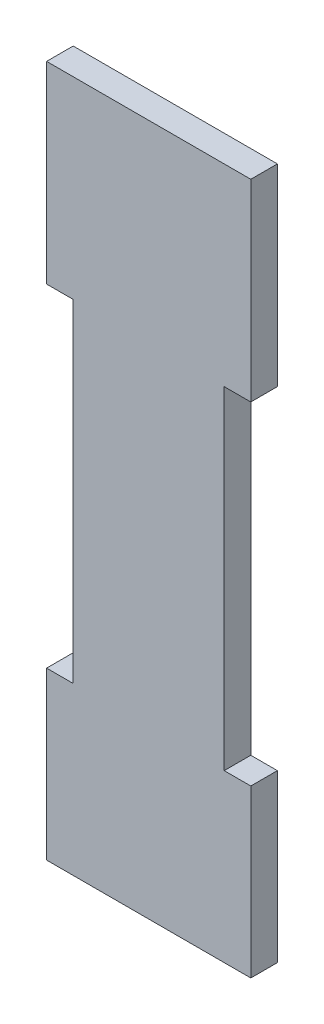
ISO-10303-21;
HEADER;
FILE_DESCRIPTION(('STEP AP214'),'2;1');
FILE_NAME('part.step','',(''),(''),'','','');
FILE_SCHEMA(('AUTOMOTIVE_DESIGN { 1 0 10303 214 1 1 1 1 }'));
ENDSEC;
DATA;
#1=APPLICATION_CONTEXT('core data for automotive mechanical design processes');
#2=APPLICATION_PROTOCOL_DEFINITION('international standard','automotive_design',2000,#1);
#3=PRODUCT_CONTEXT('',#1,'mechanical');
#4=PRODUCT('Part','Part','',(#3));
#5=PRODUCT_RELATED_PRODUCT_CATEGORY('part','',(#4));
#6=PRODUCT_DEFINITION_FORMATION('','',#4);
#7=PRODUCT_DEFINITION_CONTEXT('part definition',#1,'design');
#8=PRODUCT_DEFINITION('design','',#6,#7);
#9=PRODUCT_DEFINITION_SHAPE('','',#8);
#10=(LENGTH_UNIT() NAMED_UNIT(*) SI_UNIT(.MILLI.,.METRE.));
#11=(NAMED_UNIT(*) PLANE_ANGLE_UNIT() SI_UNIT($,.RADIAN.));
#12=(NAMED_UNIT(*) SI_UNIT($,.STERADIAN.) SOLID_ANGLE_UNIT());
#13=UNCERTAINTY_MEASURE_WITH_UNIT(LENGTH_MEASURE(1.E-05),#10,'distance_accuracy_value','');
#14=(GEOMETRIC_REPRESENTATION_CONTEXT(3) GLOBAL_UNCERTAINTY_ASSIGNED_CONTEXT((#13)) GLOBAL_UNIT_ASSIGNED_CONTEXT((#10,
#11,#12)) REPRESENTATION_CONTEXT('',''));
#15=CARTESIAN_POINT('',(0.,0.,0.));
#16=DIRECTION('',(0.,0.,1.));
#17=DIRECTION('',(1.,0.,0.));
#18=AXIS2_PLACEMENT_3D('',#15,#16,#17);
#19=CARTESIAN_POINT('',(17.7,0.,4.));
#20=DIRECTION('',(-1.,0.,0.));
#21=DIRECTION('',(0.,0.,1.));
#22=AXIS2_PLACEMENT_3D('',#19,#20,#21);
#23=PLANE('',#22);
#24=DIRECTION('',(0.,1.,0.));
#25=VECTOR('',#24,1.);
#26=CARTESIAN_POINT('',(17.7,0.,0.));
#27=LINE('',#26,#25);
#28=CARTESIAN_POINT('',(17.7,0.,0.));
#29=VERTEX_POINT('',#28);
#30=CARTESIAN_POINT('',(17.7,25.,0.));
#31=VERTEX_POINT('',#30);
#32=EDGE_CURVE('E159',#29,#31,#27,.T.);
#33=ORIENTED_EDGE('',*,*,#32,.T.);
#34=DIRECTION('',(0.,0.,-1.));
#35=VECTOR('',#34,1.);
#36=CARTESIAN_POINT('',(17.7,25.,4.));
#37=LINE('',#36,#35);
#38=CARTESIAN_POINT('',(17.7,25.,4.));
#39=VERTEX_POINT('',#38);
#40=EDGE_CURVE('E42',#39,#31,#37,.T.);
#41=ORIENTED_EDGE('',*,*,#40,.F.);
#42=DIRECTION('',(0.,1.,0.));
#43=VECTOR('',#42,1.);
#44=CARTESIAN_POINT('',(17.7,0.,4.));
#45=LINE('',#44,#43);
#46=CARTESIAN_POINT('',(17.7,0.,4.));
#47=VERTEX_POINT('',#46);
#48=EDGE_CURVE('E107',#47,#39,#45,.T.);
#49=ORIENTED_EDGE('',*,*,#48,.F.);
#50=DIRECTION('',(0.,0.,-1.));
#51=VECTOR('',#50,1.);
#52=CARTESIAN_POINT('',(17.7,0.,4.));
#53=LINE('',#52,#51);
#54=EDGE_CURVE('E11',#47,#29,#53,.T.);
#55=ORIENTED_EDGE('',*,*,#54,.T.);
#56=EDGE_LOOP('',(#33,#41,#49,#55));
#57=FACE_BOUND('',#56,.T.);
#58=ADVANCED_FACE('F34',(#57),#23,.F.);
#59=CARTESIAN_POINT('',(13.7,25.,4.));
#60=DIRECTION('',(0.,-1.,0.));
#61=DIRECTION('',(0.,0.,-1.));
#62=AXIS2_PLACEMENT_3D('',#59,#60,#61);
#63=PLANE('',#62);
#64=DIRECTION('',(-1.,0.,0.));
#65=VECTOR('',#64,1.);
#66=CARTESIAN_POINT('',(13.7,25.,0.));
#67=LINE('',#66,#65);
#68=CARTESIAN_POINT('',(13.7,25.,0.));
#69=VERTEX_POINT('',#68);
#70=EDGE_CURVE('E161',#31,#69,#67,.T.);
#71=ORIENTED_EDGE('',*,*,#70,.T.);
#72=DIRECTION('',(0.,0.,-1.));
#73=VECTOR('',#72,1.);
#74=CARTESIAN_POINT('',(13.7,25.,4.));
#75=LINE('',#74,#73);
#76=CARTESIAN_POINT('',(13.7,25.,4.));
#77=VERTEX_POINT('',#76);
#78=EDGE_CURVE('E200',#77,#69,#75,.T.);
#79=ORIENTED_EDGE('',*,*,#78,.F.);
#80=DIRECTION('',(-1.,0.,0.));
#81=VECTOR('',#80,1.);
#82=CARTESIAN_POINT('',(13.7,25.,4.));
#83=LINE('',#82,#81);
#84=EDGE_CURVE('E208',#39,#77,#83,.T.);
#85=ORIENTED_EDGE('',*,*,#84,.F.);
#86=ORIENTED_EDGE('',*,*,#40,.T.);
#87=EDGE_LOOP('',(#71,#79,#85,#86));
#88=FACE_BOUND('',#87,.T.);
#89=ADVANCED_FACE('F206',(#88),#63,.F.);
#90=CARTESIAN_POINT('',(13.7,25.,4.));
#91=DIRECTION('',(-1.,0.,0.));
#92=DIRECTION('',(0.,0.,1.));
#93=AXIS2_PLACEMENT_3D('',#90,#91,#92);
#94=PLANE('',#93);
#95=DIRECTION('',(0.,1.,0.));
#96=VECTOR('',#95,1.);
#97=CARTESIAN_POINT('',(13.7,25.,0.));
#98=LINE('',#97,#96);
#99=CARTESIAN_POINT('',(13.7,75.,0.));
#100=VERTEX_POINT('',#99);
#101=EDGE_CURVE('E163',#69,#100,#98,.T.);
#102=ORIENTED_EDGE('',*,*,#101,.T.);
#103=DIRECTION('',(0.,0.,-1.));
#104=VECTOR('',#103,1.);
#105=CARTESIAN_POINT('',(13.7,75.,4.));
#106=LINE('',#105,#104);
#107=CARTESIAN_POINT('',(13.7,75.,4.));
#108=VERTEX_POINT('',#107);
#109=EDGE_CURVE('E197',#108,#100,#106,.T.);
#110=ORIENTED_EDGE('',*,*,#109,.F.);
#111=DIRECTION('',(0.,1.,0.));
#112=VECTOR('',#111,1.);
#113=CARTESIAN_POINT('',(13.7,25.,4.));
#114=LINE('',#113,#112);
#115=EDGE_CURVE('E223',#77,#108,#114,.T.);
#116=ORIENTED_EDGE('',*,*,#115,.F.);
#117=ORIENTED_EDGE('',*,*,#78,.T.);
#118=EDGE_LOOP('',(#102,#110,#116,#117));
#119=FACE_BOUND('',#118,.T.);
#120=ADVANCED_FACE('F214',(#119),#94,.F.);
#121=CARTESIAN_POINT('',(13.7,75.,4.));
#122=DIRECTION('',(0.,1.,0.));
#123=DIRECTION('',(0.,0.,1.));
#124=AXIS2_PLACEMENT_3D('',#121,#122,#123);
#125=PLANE('',#124);
#126=DIRECTION('',(1.,0.,0.));
#127=VECTOR('',#126,1.);
#128=CARTESIAN_POINT('',(13.7,75.,0.));
#129=LINE('',#128,#127);
#130=CARTESIAN_POINT('',(17.7,75.,0.));
#131=VERTEX_POINT('',#130);
#132=EDGE_CURVE('E165',#100,#131,#129,.T.);
#133=ORIENTED_EDGE('',*,*,#132,.T.);
#134=DIRECTION('',(0.,0.,-1.));
#135=VECTOR('',#134,1.);
#136=CARTESIAN_POINT('',(17.7,75.,4.));
#137=LINE('',#136,#135);
#138=CARTESIAN_POINT('',(17.7,75.,4.));
#139=VERTEX_POINT('',#138);
#140=EDGE_CURVE('E194',#139,#131,#137,.T.);
#141=ORIENTED_EDGE('',*,*,#140,.F.);
#142=DIRECTION('',(1.,0.,0.));
#143=VECTOR('',#142,1.);
#144=CARTESIAN_POINT('',(13.7,75.,4.));
#145=LINE('',#144,#143);
#146=EDGE_CURVE('E220',#108,#139,#145,.T.);
#147=ORIENTED_EDGE('',*,*,#146,.F.);
#148=ORIENTED_EDGE('',*,*,#109,.T.);
#149=EDGE_LOOP('',(#133,#141,#147,#148));
#150=FACE_BOUND('',#149,.T.);
#151=ADVANCED_FACE('F218',(#150),#125,.F.);
#152=CARTESIAN_POINT('',(17.7,100.,4.));
#153=DIRECTION('',(-1.,0.,0.));
#154=DIRECTION('',(0.,0.,1.));
#155=AXIS2_PLACEMENT_3D('',#152,#153,#154);
#156=PLANE('',#155);
#157=DIRECTION('',(0.,1.,0.));
#158=VECTOR('',#157,1.);
#159=CARTESIAN_POINT('',(17.7,100.,0.));
#160=LINE('',#159,#158);
#161=CARTESIAN_POINT('',(17.7,104.,0.));
#162=VERTEX_POINT('',#161);
#163=EDGE_CURVE('E168',#131,#162,#160,.T.);
#164=ORIENTED_EDGE('',*,*,#163,.T.);
#165=DIRECTION('',(0.,0.,-1.));
#166=VECTOR('',#165,1.);
#167=CARTESIAN_POINT('',(17.7,104.,4.));
#168=LINE('',#167,#166);
#169=CARTESIAN_POINT('',(17.7,104.,4.));
#170=VERTEX_POINT('',#169);
#171=EDGE_CURVE('E191',#170,#162,#168,.T.);
#172=ORIENTED_EDGE('',*,*,#171,.F.);
#173=DIRECTION('',(0.,1.,0.));
#174=VECTOR('',#173,1.);
#175=CARTESIAN_POINT('',(17.7,100.,4.));
#176=LINE('',#175,#174);
#177=EDGE_CURVE('E222',#139,#170,#176,.T.);
#178=ORIENTED_EDGE('',*,*,#177,.F.);
#179=ORIENTED_EDGE('',*,*,#140,.T.);
#180=EDGE_LOOP('',(#164,#172,#178,#179));
#181=FACE_BOUND('',#180,.T.);
#182=ADVANCED_FACE('F256',(#181),#156,.F.);
#183=CARTESIAN_POINT('',(-13.,104.,4.));
#184=DIRECTION('',(0.,-1.,0.));
#185=DIRECTION('',(0.,0.,-1.));
#186=AXIS2_PLACEMENT_3D('',#183,#184,#185);
#187=PLANE('',#186);
#188=DIRECTION('',(-1.,0.,0.));
#189=VECTOR('',#188,1.);
#190=CARTESIAN_POINT('',(-13.,104.,0.));
#191=LINE('',#190,#189);
#192=CARTESIAN_POINT('',(-13.,104.,0.));
#193=VERTEX_POINT('',#192);
#194=EDGE_CURVE('E170',#162,#193,#191,.T.);
#195=ORIENTED_EDGE('',*,*,#194,.T.);
#196=DIRECTION('',(0.,0.,-1.));
#197=VECTOR('',#196,1.);
#198=CARTESIAN_POINT('',(-13.,104.,4.));
#199=LINE('',#198,#197);
#200=CARTESIAN_POINT('',(-13.,104.,4.));
#201=VERTEX_POINT('',#200);
#202=EDGE_CURVE('E188',#201,#193,#199,.T.);
#203=ORIENTED_EDGE('',*,*,#202,.F.);
#204=DIRECTION('',(-1.,0.,0.));
#205=VECTOR('',#204,1.);
#206=CARTESIAN_POINT('',(-13.,104.,4.));
#207=LINE('',#206,#205);
#208=EDGE_CURVE('E225',#170,#201,#207,.T.);
#209=ORIENTED_EDGE('',*,*,#208,.F.);
#210=ORIENTED_EDGE('',*,*,#171,.T.);
#211=EDGE_LOOP('',(#195,#203,#209,#210));
#212=FACE_BOUND('',#211,.T.);
#213=ADVANCED_FACE('F259',(#212),#187,.F.);
#214=CARTESIAN_POINT('',(-13.,100.,4.));
#215=DIRECTION('',(1.,0.,0.));
#216=DIRECTION('',(0.,0.,-1.));
#217=AXIS2_PLACEMENT_3D('',#214,#215,#216);
#218=PLANE('',#217);
#219=DIRECTION('',(0.,-1.,0.));
#220=VECTOR('',#219,1.);
#221=CARTESIAN_POINT('',(-13.,100.,0.));
#222=LINE('',#221,#220);
#223=CARTESIAN_POINT('',(-13.,75.,0.));
#224=VERTEX_POINT('',#223);
#225=EDGE_CURVE('E173',#193,#224,#222,.T.);
#226=ORIENTED_EDGE('',*,*,#225,.T.);
#227=DIRECTION('',(0.,0.,-1.));
#228=VECTOR('',#227,1.);
#229=CARTESIAN_POINT('',(-13.,75.,4.));
#230=LINE('',#229,#228);
#231=CARTESIAN_POINT('',(-13.,75.,4.));
#232=VERTEX_POINT('',#231);
#233=EDGE_CURVE('E185',#232,#224,#230,.T.);
#234=ORIENTED_EDGE('',*,*,#233,.F.);
#235=DIRECTION('',(0.,-1.,0.));
#236=VECTOR('',#235,1.);
#237=CARTESIAN_POINT('',(-13.,100.,4.));
#238=LINE('',#237,#236);
#239=EDGE_CURVE('E231',#201,#232,#238,.T.);
#240=ORIENTED_EDGE('',*,*,#239,.F.);
#241=ORIENTED_EDGE('',*,*,#202,.T.);
#242=EDGE_LOOP('',(#226,#234,#240,#241));
#243=FACE_BOUND('',#242,.T.);
#244=ADVANCED_FACE('F237',(#243),#218,.F.);
#245=CARTESIAN_POINT('',(-8.99999999999999,75.,4.));
#246=DIRECTION('',(0.,1.,0.));
#247=DIRECTION('',(0.,0.,1.));
#248=AXIS2_PLACEMENT_3D('',#245,#246,#247);
#249=PLANE('',#248);
#250=DIRECTION('',(1.,0.,0.));
#251=VECTOR('',#250,1.);
#252=CARTESIAN_POINT('',(-8.99999999999999,75.,0.));
#253=LINE('',#252,#251);
#254=CARTESIAN_POINT('',(-8.99999999999999,75.,0.));
#255=VERTEX_POINT('',#254);
#256=EDGE_CURVE('E175',#224,#255,#253,.T.);
#257=ORIENTED_EDGE('',*,*,#256,.T.);
#258=DIRECTION('',(0.,0.,-1.));
#259=VECTOR('',#258,1.);
#260=CARTESIAN_POINT('',(-8.99999999999999,75.,4.));
#261=LINE('',#260,#259);
#262=CARTESIAN_POINT('',(-8.99999999999999,75.,4.));
#263=VERTEX_POINT('',#262);
#264=EDGE_CURVE('E148',#263,#255,#261,.T.);
#265=ORIENTED_EDGE('',*,*,#264,.F.);
#266=DIRECTION('',(1.,0.,0.));
#267=VECTOR('',#266,1.);
#268=CARTESIAN_POINT('',(-8.99999999999999,75.,4.));
#269=LINE('',#268,#267);
#270=EDGE_CURVE('E139',#232,#263,#269,.T.);
#271=ORIENTED_EDGE('',*,*,#270,.F.);
#272=ORIENTED_EDGE('',*,*,#233,.T.);
#273=EDGE_LOOP('',(#257,#265,#271,#272));
#274=FACE_BOUND('',#273,.T.);
#275=ADVANCED_FACE('F240',(#274),#249,.F.);
#276=CARTESIAN_POINT('',(-8.99999999999999,25.,4.));
#277=DIRECTION('',(1.,0.,0.));
#278=DIRECTION('',(0.,0.,-1.));
#279=AXIS2_PLACEMENT_3D('',#276,#277,#278);
#280=PLANE('',#279);
#281=DIRECTION('',(0.,-1.,0.));
#282=VECTOR('',#281,1.);
#283=CARTESIAN_POINT('',(-8.99999999999999,25.,0.));
#284=LINE('',#283,#282);
#285=CARTESIAN_POINT('',(-8.99999999999999,25.,0.));
#286=VERTEX_POINT('',#285);
#287=EDGE_CURVE('E147',#255,#286,#284,.T.);
#288=ORIENTED_EDGE('',*,*,#287,.T.);
#289=DIRECTION('',(0.,0.,-1.));
#290=VECTOR('',#289,1.);
#291=CARTESIAN_POINT('',(-8.99999999999999,25.,4.));
#292=LINE('',#291,#290);
#293=CARTESIAN_POINT('',(-8.99999999999999,25.,4.));
#294=VERTEX_POINT('',#293);
#295=EDGE_CURVE('E144',#294,#286,#292,.T.);
#296=ORIENTED_EDGE('',*,*,#295,.F.);
#297=DIRECTION('',(0.,-1.,0.));
#298=VECTOR('',#297,1.);
#299=CARTESIAN_POINT('',(-8.99999999999999,25.,4.));
#300=LINE('',#299,#298);
#301=EDGE_CURVE('E133',#263,#294,#300,.T.);
#302=ORIENTED_EDGE('',*,*,#301,.F.);
#303=ORIENTED_EDGE('',*,*,#264,.T.);
#304=EDGE_LOOP('',(#288,#296,#302,#303));
#305=FACE_BOUND('',#304,.T.);
#306=ADVANCED_FACE('F145',(#305),#280,.F.);
#307=CARTESIAN_POINT('',(-8.99999999999999,25.,4.));
#308=DIRECTION('',(0.,-1.,0.));
#309=DIRECTION('',(0.,0.,-1.));
#310=AXIS2_PLACEMENT_3D('',#307,#308,#309);
#311=PLANE('',#310);
#312=DIRECTION('',(-1.,0.,0.));
#313=VECTOR('',#312,1.);
#314=CARTESIAN_POINT('',(-8.99999999999999,25.,0.));
#315=LINE('',#314,#313);
#316=CARTESIAN_POINT('',(-13.,25.,0.));
#317=VERTEX_POINT('',#316);
#318=EDGE_CURVE('E92',#286,#317,#315,.T.);
#319=ORIENTED_EDGE('',*,*,#318,.T.);
#320=DIRECTION('',(0.,0.,-1.));
#321=VECTOR('',#320,1.);
#322=CARTESIAN_POINT('',(-13.,25.,4.));
#323=LINE('',#322,#321);
#324=CARTESIAN_POINT('',(-13.,25.,4.));
#325=VERTEX_POINT('',#324);
#326=EDGE_CURVE('E149',#325,#317,#323,.T.);
#327=ORIENTED_EDGE('',*,*,#326,.F.);
#328=DIRECTION('',(-1.,0.,0.));
#329=VECTOR('',#328,1.);
#330=CARTESIAN_POINT('',(-8.99999999999999,25.,4.));
#331=LINE('',#330,#329);
#332=EDGE_CURVE('E137',#294,#325,#331,.T.);
#333=ORIENTED_EDGE('',*,*,#332,.F.);
#334=ORIENTED_EDGE('',*,*,#295,.T.);
#335=EDGE_LOOP('',(#319,#327,#333,#334));
#336=FACE_BOUND('',#335,.T.);
#337=ADVANCED_FACE('F151',(#336),#311,.F.);
#338=CARTESIAN_POINT('',(-13.,0.,4.));
#339=DIRECTION('',(1.,0.,0.));
#340=DIRECTION('',(0.,0.,-1.));
#341=AXIS2_PLACEMENT_3D('',#338,#339,#340);
#342=PLANE('',#341);
#343=DIRECTION('',(0.,-1.,0.));
#344=VECTOR('',#343,1.);
#345=CARTESIAN_POINT('',(-13.,0.,0.));
#346=LINE('',#345,#344);
#347=CARTESIAN_POINT('',(-13.,0.,0.));
#348=VERTEX_POINT('',#347);
#349=EDGE_CURVE('E179',#317,#348,#346,.T.);
#350=ORIENTED_EDGE('',*,*,#349,.T.);
#351=DIRECTION('',(0.,0.,-1.));
#352=VECTOR('',#351,1.);
#353=CARTESIAN_POINT('',(-13.,0.,4.));
#354=LINE('',#353,#352);
#355=CARTESIAN_POINT('',(-13.,0.,4.));
#356=VERTEX_POINT('',#355);
#357=EDGE_CURVE('E155',#356,#348,#354,.T.);
#358=ORIENTED_EDGE('',*,*,#357,.F.);
#359=DIRECTION('',(0.,-1.,0.));
#360=VECTOR('',#359,1.);
#361=CARTESIAN_POINT('',(-13.,0.,4.));
#362=LINE('',#361,#360);
#363=EDGE_CURVE('E153',#325,#356,#362,.T.);
#364=ORIENTED_EDGE('',*,*,#363,.F.);
#365=ORIENTED_EDGE('',*,*,#326,.T.);
#366=EDGE_LOOP('',(#350,#358,#364,#365));
#367=FACE_BOUND('',#366,.T.);
#368=ADVANCED_FACE('F243',(#367),#342,.F.);
#369=CARTESIAN_POINT('',(0.,0.,4.));
#370=DIRECTION('',(0.,1.,0.));
#371=DIRECTION('',(-1.,0.,0.));
#372=AXIS2_PLACEMENT_3D('',#369,#370,#371);
#373=PLANE('',#372);
#374=DIRECTION('',(1.,0.,0.));
#375=VECTOR('',#374,1.);
#376=CARTESIAN_POINT('',(0.,0.,0.));
#377=LINE('',#376,#375);
#378=EDGE_CURVE('E99',#348,#29,#377,.T.);
#379=ORIENTED_EDGE('',*,*,#378,.T.);
#380=ORIENTED_EDGE('',*,*,#54,.F.);
#381=DIRECTION('',(1.,0.,0.));
#382=VECTOR('',#381,1.);
#383=CARTESIAN_POINT('',(0.,0.,4.));
#384=LINE('',#383,#382);
#385=EDGE_CURVE('E50',#356,#47,#384,.T.);
#386=ORIENTED_EDGE('',*,*,#385,.F.);
#387=ORIENTED_EDGE('',*,*,#357,.T.);
#388=EDGE_LOOP('',(#379,#380,#386,#387));
#389=FACE_BOUND('',#388,.T.);
#390=ADVANCED_FACE('F244',(#389),#373,.F.);
#391=CARTESIAN_POINT('',(0.,0.,4.));
#392=DIRECTION('',(0.,0.,1.));
#393=DIRECTION('',(1.,0.,0.));
#394=AXIS2_PLACEMENT_3D('',#391,#392,#393);
#395=PLANE('',#394);
#396=ORIENTED_EDGE('',*,*,#385,.T.);
#397=ORIENTED_EDGE('',*,*,#48,.T.);
#398=ORIENTED_EDGE('',*,*,#84,.T.);
#399=ORIENTED_EDGE('',*,*,#115,.T.);
#400=ORIENTED_EDGE('',*,*,#146,.T.);
#401=ORIENTED_EDGE('',*,*,#177,.T.);
#402=ORIENTED_EDGE('',*,*,#208,.T.);
#403=ORIENTED_EDGE('',*,*,#239,.T.);
#404=ORIENTED_EDGE('',*,*,#270,.T.);
#405=ORIENTED_EDGE('',*,*,#301,.T.);
#406=ORIENTED_EDGE('',*,*,#332,.T.);
#407=ORIENTED_EDGE('',*,*,#363,.T.);
#408=EDGE_LOOP('',(#396,#397,#398,#399,#400,#401,#402,#403,#404,#405,#406,#407));
#409=FACE_BOUND('',#408,.T.);
#410=ADVANCED_FACE('F135',(#409),#395,.T.);
#411=CARTESIAN_POINT('',(0.,0.,0.));
#412=DIRECTION('',(0.,0.,1.));
#413=DIRECTION('',(1.,0.,0.));
#414=AXIS2_PLACEMENT_3D('',#411,#412,#413);
#415=PLANE('',#414);
#416=ORIENTED_EDGE('',*,*,#32,.F.);
#417=ORIENTED_EDGE('',*,*,#378,.F.);
#418=ORIENTED_EDGE('',*,*,#349,.F.);
#419=ORIENTED_EDGE('',*,*,#318,.F.);
#420=ORIENTED_EDGE('',*,*,#287,.F.);
#421=ORIENTED_EDGE('',*,*,#256,.F.);
#422=ORIENTED_EDGE('',*,*,#225,.F.);
#423=ORIENTED_EDGE('',*,*,#194,.F.);
#424=ORIENTED_EDGE('',*,*,#163,.F.);
#425=ORIENTED_EDGE('',*,*,#132,.F.);
#426=ORIENTED_EDGE('',*,*,#101,.F.);
#427=ORIENTED_EDGE('',*,*,#70,.F.);
#428=EDGE_LOOP('',(#416,#417,#418,#419,#420,#421,#422,#423,#424,#425,#426,#427));
#429=FACE_BOUND('',#428,.T.);
#430=ADVANCED_FACE('F210',(#429),#415,.F.);
#431=CLOSED_SHELL('',(#58,#89,#120,#151,#182,#213,#244,#275,#306,#337,#368,#390,#410,#430));
#432=MANIFOLD_SOLID_BREP('B2',#431);
#433=ADVANCED_BREP_SHAPE_REPRESENTATION('',(#18,#432),#14);
#434=SHAPE_DEFINITION_REPRESENTATION(#9,#433);
ENDSEC;
END-ISO-10303-21;
